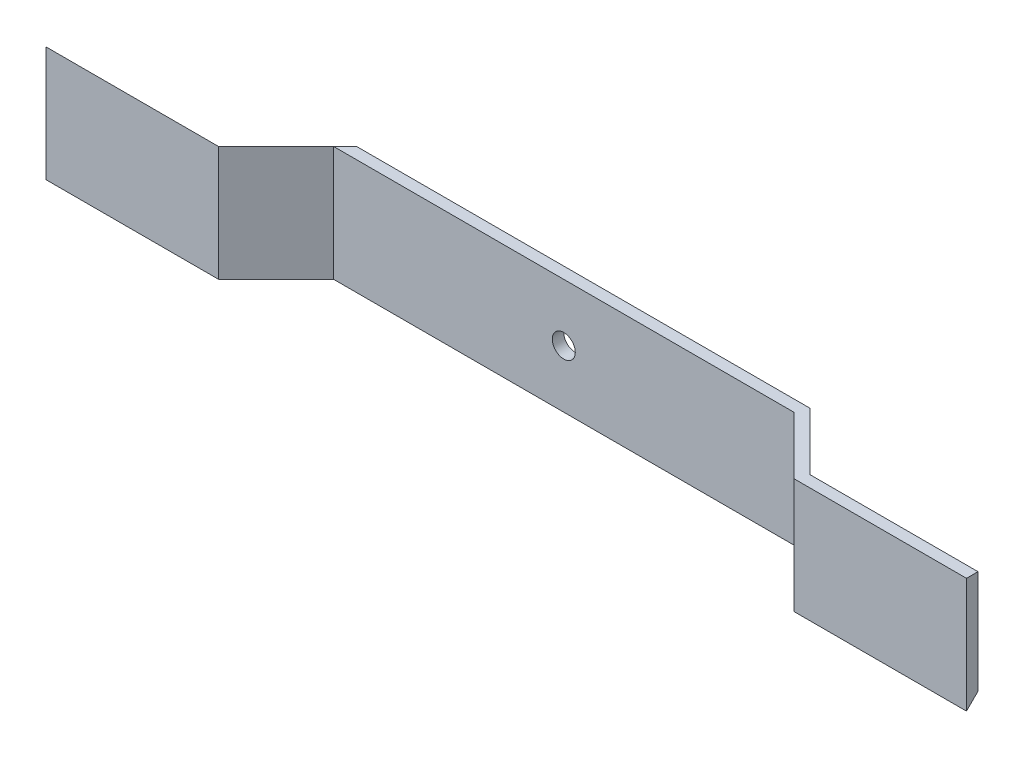
ISO-10303-21;
HEADER;
FILE_DESCRIPTION(('STEP AP214'),'2;1');
FILE_NAME('part.step','',(''),(''),'','','');
FILE_SCHEMA(('AUTOMOTIVE_DESIGN { 1 0 10303 214 1 1 1 1 }'));
ENDSEC;
DATA;
#1=APPLICATION_CONTEXT('core data for automotive mechanical design processes');
#2=APPLICATION_PROTOCOL_DEFINITION('international standard','automotive_design',2000,#1);
#3=PRODUCT_CONTEXT('',#1,'mechanical');
#4=PRODUCT('Part','Part','',(#3));
#5=PRODUCT_RELATED_PRODUCT_CATEGORY('part','',(#4));
#6=PRODUCT_DEFINITION_FORMATION('','',#4);
#7=PRODUCT_DEFINITION_CONTEXT('part definition',#1,'design');
#8=PRODUCT_DEFINITION('design','',#6,#7);
#9=PRODUCT_DEFINITION_SHAPE('','',#8);
#10=(LENGTH_UNIT() NAMED_UNIT(*) SI_UNIT(.MILLI.,.METRE.));
#11=(NAMED_UNIT(*) PLANE_ANGLE_UNIT() SI_UNIT($,.RADIAN.));
#12=(NAMED_UNIT(*) SI_UNIT($,.STERADIAN.) SOLID_ANGLE_UNIT());
#13=UNCERTAINTY_MEASURE_WITH_UNIT(LENGTH_MEASURE(1.E-05),#10,'distance_accuracy_value','');
#14=(GEOMETRIC_REPRESENTATION_CONTEXT(3) GLOBAL_UNCERTAINTY_ASSIGNED_CONTEXT((#13)) GLOBAL_UNIT_ASSIGNED_CONTEXT((#10,
#11,#12)) REPRESENTATION_CONTEXT('',''));
#15=CARTESIAN_POINT('',(0.,0.,0.));
#16=DIRECTION('',(0.,0.,1.));
#17=DIRECTION('',(1.,0.,0.));
#18=AXIS2_PLACEMENT_3D('',#15,#16,#17);
#19=CARTESIAN_POINT('',(-27.2373225025512,10.,0.));
#20=DIRECTION('',(-0.707106781186554,0.,-0.707106781186541));
#21=DIRECTION('',(-0.707106781186541,0.,0.707106781186554));
#22=AXIS2_PLACEMENT_3D('',#19,#20,#21);
#23=PLANE('',#22);
#24=DIRECTION('',(0.707106781186541,0.,-0.707106781186554));
#25=VECTOR('',#24,1.);
#26=CARTESIAN_POINT('',(-27.2373225025512,0.,0.));
#27=LINE('',#26,#25);
#28=CARTESIAN_POINT('',(-32.2373225025511,0.,5.));
#29=VERTEX_POINT('',#28);
#30=CARTESIAN_POINT('',(-27.2373225025512,0.,0.));
#31=VERTEX_POINT('',#30);
#32=EDGE_CURVE('E166',#29,#31,#27,.T.);
#33=ORIENTED_EDGE('',*,*,#32,.T.);
#34=DIRECTION('',(0.,-1.,0.));
#35=VECTOR('',#34,1.);
#36=CARTESIAN_POINT('',(-27.2373225025512,10.,0.));
#37=LINE('',#36,#35);
#38=CARTESIAN_POINT('',(-27.2373225025512,10.,0.));
#39=VERTEX_POINT('',#38);
#40=EDGE_CURVE('E153',#39,#31,#37,.T.);
#41=ORIENTED_EDGE('',*,*,#40,.F.);
#42=DIRECTION('',(0.707106781186541,0.,-0.707106781186554));
#43=VECTOR('',#42,1.);
#44=CARTESIAN_POINT('',(-27.2373225025512,10.,0.));
#45=LINE('',#44,#43);
#46=CARTESIAN_POINT('',(-32.2373225025511,10.,5.));
#47=VERTEX_POINT('',#46);
#48=EDGE_CURVE('E130',#47,#39,#45,.T.);
#49=ORIENTED_EDGE('',*,*,#48,.F.);
#50=DIRECTION('',(0.,-1.,0.));
#51=VECTOR('',#50,1.);
#52=CARTESIAN_POINT('',(-32.2373225025511,10.,5.));
#53=LINE('',#52,#51);
#54=EDGE_CURVE('E213',#47,#29,#53,.T.);
#55=ORIENTED_EDGE('',*,*,#54,.T.);
#56=EDGE_LOOP('',(#33,#41,#49,#55));
#57=FACE_BOUND('',#56,.T.);
#58=ADVANCED_FACE('F32',(#57),#23,.F.);
#59=CARTESIAN_POINT('',(-27.2373225025512,10.,0.));
#60=DIRECTION('',(0.,0.,-1.));
#61=DIRECTION('',(-1.,0.,0.));
#62=AXIS2_PLACEMENT_3D('',#59,#60,#61);
#63=PLANE('',#62);
#64=CARTESIAN_POINT('',(-7.23732250255115,5.,0.));
#65=DIRECTION('',(0.,0.,1.));
#66=DIRECTION('',(1.,0.,0.));
#67=AXIS2_PLACEMENT_3D('',#64,#65,#66);
#68=CIRCLE('',#67,1.);
#69=CARTESIAN_POINT('',(-6.23732250255115,5.,0.));
#70=VERTEX_POINT('',#69);
#71=EDGE_CURVE('E193',#70,#70,#68,.T.);
#72=ORIENTED_EDGE('',*,*,#71,.F.);
#73=EDGE_LOOP('',(#72));
#74=FACE_BOUND('',#73,.T.);
#75=DIRECTION('',(1.,0.,0.));
#76=VECTOR('',#75,1.);
#77=CARTESIAN_POINT('',(-27.2373225025512,0.,0.));
#78=LINE('',#77,#76);
#79=CARTESIAN_POINT('',(12.7626774974489,0.,0.));
#80=VERTEX_POINT('',#79);
#81=EDGE_CURVE('E215',#31,#80,#78,.T.);
#82=ORIENTED_EDGE('',*,*,#81,.T.);
#83=DIRECTION('',(0.,-1.,0.));
#84=VECTOR('',#83,1.);
#85=CARTESIAN_POINT('',(12.7626774974489,10.,0.));
#86=LINE('',#85,#84);
#87=CARTESIAN_POINT('',(12.7626774974489,10.,0.));
#88=VERTEX_POINT('',#87);
#89=EDGE_CURVE('E161',#88,#80,#86,.T.);
#90=ORIENTED_EDGE('',*,*,#89,.F.);
#91=DIRECTION('',(1.,0.,0.));
#92=VECTOR('',#91,1.);
#93=CARTESIAN_POINT('',(-27.2373225025512,10.,0.));
#94=LINE('',#93,#92);
#95=EDGE_CURVE('E142',#39,#88,#94,.T.);
#96=ORIENTED_EDGE('',*,*,#95,.F.);
#97=ORIENTED_EDGE('',*,*,#40,.T.);
#98=EDGE_LOOP('',(#82,#90,#96,#97));
#99=FACE_BOUND('',#98,.T.);
#100=ADVANCED_FACE('F158',(#74,#99),#63,.F.);
#101=CARTESIAN_POINT('',(12.7626774974489,10.,0.));
#102=DIRECTION('',(0.707106781186541,0.,-0.707106781186554));
#103=DIRECTION('',(-0.707106781186554,0.,-0.707106781186541));
#104=AXIS2_PLACEMENT_3D('',#101,#102,#103);
#105=PLANE('',#104);
#106=DIRECTION('',(0.707106781186554,0.,0.707106781186541));
#107=VECTOR('',#106,1.);
#108=CARTESIAN_POINT('',(12.7626774974489,0.,0.));
#109=LINE('',#108,#107);
#110=CARTESIAN_POINT('',(17.7626774974489,0.,5.));
#111=VERTEX_POINT('',#110);
#112=EDGE_CURVE('E217',#80,#111,#109,.T.);
#113=ORIENTED_EDGE('',*,*,#112,.T.);
#114=DIRECTION('',(0.,-1.,0.));
#115=VECTOR('',#114,1.);
#116=CARTESIAN_POINT('',(17.7626774974489,10.,5.));
#117=LINE('',#116,#115);
#118=CARTESIAN_POINT('',(17.7626774974489,10.,5.));
#119=VERTEX_POINT('',#118);
#120=EDGE_CURVE('E168',#119,#111,#117,.T.);
#121=ORIENTED_EDGE('',*,*,#120,.F.);
#122=DIRECTION('',(0.707106781186554,0.,0.707106781186541));
#123=VECTOR('',#122,1.);
#124=CARTESIAN_POINT('',(12.7626774974489,10.,0.));
#125=LINE('',#124,#123);
#126=EDGE_CURVE('E163',#88,#119,#125,.T.);
#127=ORIENTED_EDGE('',*,*,#126,.F.);
#128=ORIENTED_EDGE('',*,*,#89,.T.);
#129=EDGE_LOOP('',(#113,#121,#127,#128));
#130=FACE_BOUND('',#129,.T.);
#131=ADVANCED_FACE('F278',(#130),#105,.F.);
#132=CARTESIAN_POINT('',(17.7626774974489,10.,5.));
#133=DIRECTION('',(0.,0.,-1.));
#134=DIRECTION('',(-1.,0.,0.));
#135=AXIS2_PLACEMENT_3D('',#132,#133,#134);
#136=PLANE('',#135);
#137=DIRECTION('',(1.,0.,0.));
#138=VECTOR('',#137,1.);
#139=CARTESIAN_POINT('',(17.7626774974489,0.,5.));
#140=LINE('',#139,#138);
#141=CARTESIAN_POINT('',(32.7626774974489,0.,5.));
#142=VERTEX_POINT('',#141);
#143=EDGE_CURVE('E219',#111,#142,#140,.T.);
#144=ORIENTED_EDGE('',*,*,#143,.T.);
#145=DIRECTION('',(0.,-1.,0.));
#146=VECTOR('',#145,1.);
#147=CARTESIAN_POINT('',(32.7626774974489,10.,5.));
#148=LINE('',#147,#146);
#149=CARTESIAN_POINT('',(32.7626774974489,10.,5.));
#150=VERTEX_POINT('',#149);
#151=EDGE_CURVE('E250',#150,#142,#148,.T.);
#152=ORIENTED_EDGE('',*,*,#151,.F.);
#153=DIRECTION('',(1.,0.,0.));
#154=VECTOR('',#153,1.);
#155=CARTESIAN_POINT('',(17.7626774974489,10.,5.));
#156=LINE('',#155,#154);
#157=EDGE_CURVE('E202',#119,#150,#156,.T.);
#158=ORIENTED_EDGE('',*,*,#157,.F.);
#159=ORIENTED_EDGE('',*,*,#120,.T.);
#160=EDGE_LOOP('',(#144,#152,#158,#159));
#161=FACE_BOUND('',#160,.T.);
#162=ADVANCED_FACE('F256',(#161),#136,.F.);
#163=CARTESIAN_POINT('',(32.7626774974489,10.,4.));
#164=DIRECTION('',(-1.,0.,0.));
#165=DIRECTION('',(0.,0.,1.));
#166=AXIS2_PLACEMENT_3D('',#163,#164,#165);
#167=PLANE('',#166);
#168=ORIENTED_EDGE('',*,*,#151,.T.);
#169=DIRECTION('',(0.,-0.707106781186545,0.70710678118655));
#170=VECTOR('',#169,1.);
#171=CARTESIAN_POINT('',(32.7626774974489,0.999999999999994,4.));
#172=LINE('',#171,#170);
#173=CARTESIAN_POINT('',(32.7626774974489,0.999999999999997,4.));
#174=VERTEX_POINT('',#173);
#175=EDGE_CURVE('E11',#142,#174,#172,.F.);
#176=ORIENTED_EDGE('',*,*,#175,.T.);
#177=DIRECTION('',(0.,-1.,0.));
#178=VECTOR('',#177,1.);
#179=CARTESIAN_POINT('',(32.7626774974489,10.,4.));
#180=LINE('',#179,#178);
#181=CARTESIAN_POINT('',(32.7626774974489,10.,4.));
#182=VERTEX_POINT('',#181);
#183=EDGE_CURVE('E248',#182,#174,#180,.T.);
#184=ORIENTED_EDGE('',*,*,#183,.F.);
#185=DIRECTION('',(0.,0.,-1.));
#186=VECTOR('',#185,1.);
#187=CARTESIAN_POINT('',(32.7626774974489,10.,4.));
#188=LINE('',#187,#186);
#189=EDGE_CURVE('E204',#150,#182,#188,.T.);
#190=ORIENTED_EDGE('',*,*,#189,.F.);
#191=EDGE_LOOP('',(#168,#176,#184,#190));
#192=FACE_BOUND('',#191,.T.);
#193=ADVANCED_FACE('F270',(#192),#167,.F.);
#194=CARTESIAN_POINT('',(18.176891059822,10.,4.));
#195=DIRECTION('',(0.,0.,1.));
#196=DIRECTION('',(1.,0.,0.));
#197=AXIS2_PLACEMENT_3D('',#194,#195,#196);
#198=PLANE('',#197);
#199=ORIENTED_EDGE('',*,*,#183,.T.);
#200=DIRECTION('',(-1.,0.,0.));
#201=VECTOR('',#200,1.);
#202=CARTESIAN_POINT('',(18.176891059822,0.999999999999994,4.));
#203=LINE('',#202,#201);
#204=CARTESIAN_POINT('',(18.176891059822,0.999999999999994,4.));
#205=VERTEX_POINT('',#204);
#206=EDGE_CURVE('E41',#174,#205,#203,.T.);
#207=ORIENTED_EDGE('',*,*,#206,.T.);
#208=DIRECTION('',(0.,-1.,0.));
#209=VECTOR('',#208,1.);
#210=CARTESIAN_POINT('',(18.176891059822,10.,4.));
#211=LINE('',#210,#209);
#212=CARTESIAN_POINT('',(18.176891059822,10.,4.));
#213=VERTEX_POINT('',#212);
#214=EDGE_CURVE('E245',#213,#205,#211,.T.);
#215=ORIENTED_EDGE('',*,*,#214,.F.);
#216=DIRECTION('',(-1.,0.,0.));
#217=VECTOR('',#216,1.);
#218=CARTESIAN_POINT('',(18.176891059822,10.,4.));
#219=LINE('',#218,#217);
#220=EDGE_CURVE('E206',#182,#213,#219,.T.);
#221=ORIENTED_EDGE('',*,*,#220,.F.);
#222=EDGE_LOOP('',(#199,#207,#215,#221));
#223=FACE_BOUND('',#222,.T.);
#224=ADVANCED_FACE('F263',(#223),#198,.F.);
#225=CARTESIAN_POINT('',(13.1768910598219,10.,-1.));
#226=DIRECTION('',(-0.707106781186541,0.,0.707106781186554));
#227=DIRECTION('',(0.707106781186554,0.,0.707106781186541));
#228=AXIS2_PLACEMENT_3D('',#225,#226,#227);
#229=PLANE('',#228);
#230=ORIENTED_EDGE('',*,*,#214,.T.);
#231=DIRECTION('',(-0.707106781186554,0.,-0.707106781186541));
#232=VECTOR('',#231,1.);
#233=CARTESIAN_POINT('',(13.1768910598219,0.999999999999994,-1.));
#234=LINE('',#233,#232);
#235=CARTESIAN_POINT('',(13.1768910598219,0.999999999999993,-1.));
#236=VERTEX_POINT('',#235);
#237=EDGE_CURVE('E179',#205,#236,#234,.T.);
#238=ORIENTED_EDGE('',*,*,#237,.T.);
#239=DIRECTION('',(0.,-1.,0.));
#240=VECTOR('',#239,1.);
#241=CARTESIAN_POINT('',(13.1768910598219,10.,-1.));
#242=LINE('',#241,#240);
#243=CARTESIAN_POINT('',(13.1768910598219,10.,-1.));
#244=VERTEX_POINT('',#243);
#245=EDGE_CURVE('E243',#244,#236,#242,.T.);
#246=ORIENTED_EDGE('',*,*,#245,.F.);
#247=DIRECTION('',(-0.707106781186554,0.,-0.707106781186541));
#248=VECTOR('',#247,1.);
#249=CARTESIAN_POINT('',(13.1768910598219,10.,-1.));
#250=LINE('',#249,#248);
#251=EDGE_CURVE('E208',#213,#244,#250,.T.);
#252=ORIENTED_EDGE('',*,*,#251,.F.);
#253=EDGE_LOOP('',(#230,#238,#246,#252));
#254=FACE_BOUND('',#253,.T.);
#255=ADVANCED_FACE('F267',(#254),#229,.F.);
#256=CARTESIAN_POINT('',(-27.6515360649243,10.,-1.));
#257=DIRECTION('',(0.,0.,1.));
#258=DIRECTION('',(1.,0.,0.));
#259=AXIS2_PLACEMENT_3D('',#256,#257,#258);
#260=PLANE('',#259);
#261=CARTESIAN_POINT('',(-7.23732250255115,5.,-1.));
#262=DIRECTION('',(0.,0.,1.));
#263=DIRECTION('',(1.,0.,0.));
#264=AXIS2_PLACEMENT_3D('',#261,#262,#263);
#265=CIRCLE('',#264,1.);
#266=CARTESIAN_POINT('',(-6.23732250255115,5.,-1.));
#267=VERTEX_POINT('',#266);
#268=EDGE_CURVE('E36',#267,#267,#265,.T.);
#269=ORIENTED_EDGE('',*,*,#268,.T.);
#270=EDGE_LOOP('',(#269));
#271=FACE_BOUND('',#270,.T.);
#272=ORIENTED_EDGE('',*,*,#245,.T.);
#273=DIRECTION('',(0.81649658092773,0.57735026918962,0.));
#274=VECTOR('',#273,1.);
#275=CARTESIAN_POINT('',(13.1768910598219,0.999999999999994,-1.));
#276=LINE('',#275,#274);
#277=CARTESIAN_POINT('',(11.7626774974488,0.,-1.));
#278=VERTEX_POINT('',#277);
#279=EDGE_CURVE('E55',#236,#278,#276,.F.);
#280=ORIENTED_EDGE('',*,*,#279,.T.);
#281=DIRECTION('',(-1.,0.,0.));
#282=VECTOR('',#281,1.);
#283=CARTESIAN_POINT('',(-27.6515360649243,0.,-1.));
#284=LINE('',#283,#282);
#285=CARTESIAN_POINT('',(-27.6515360649243,0.,-1.));
#286=VERTEX_POINT('',#285);
#287=EDGE_CURVE('E221',#278,#286,#284,.T.);
#288=ORIENTED_EDGE('',*,*,#287,.T.);
#289=DIRECTION('',(0.,-1.,0.));
#290=VECTOR('',#289,1.);
#291=CARTESIAN_POINT('',(-27.6515360649243,10.,-1.));
#292=LINE('',#291,#290);
#293=CARTESIAN_POINT('',(-27.6515360649243,8.99999999999999,-1.));
#294=VERTEX_POINT('',#293);
#295=EDGE_CURVE('E240',#294,#286,#292,.T.);
#296=ORIENTED_EDGE('',*,*,#295,.F.);
#297=DIRECTION('',(0.816496580927722,0.577350269189632,0.));
#298=VECTOR('',#297,1.);
#299=CARTESIAN_POINT('',(-17.8248816683677,15.9484939601818,-0.999999999999999));
#300=LINE('',#299,#298);
#301=CARTESIAN_POINT('',(-26.2373225025512,10.,-1.));
#302=VERTEX_POINT('',#301);
#303=EDGE_CURVE('E173',#294,#302,#300,.T.);
#304=ORIENTED_EDGE('',*,*,#303,.T.);
#305=DIRECTION('',(-1.,0.,0.));
#306=VECTOR('',#305,1.);
#307=CARTESIAN_POINT('',(-27.6515360649243,10.,-1.));
#308=LINE('',#307,#306);
#309=EDGE_CURVE('E151',#244,#302,#308,.T.);
#310=ORIENTED_EDGE('',*,*,#309,.F.);
#311=EDGE_LOOP('',(#272,#280,#288,#296,#304,#310));
#312=FACE_BOUND('',#311,.T.);
#313=ADVANCED_FACE('F333',(#271,#312),#260,.F.);
#314=CARTESIAN_POINT('',(-27.6515360649243,10.,-1.));
#315=DIRECTION('',(0.707106781186554,0.,0.707106781186541));
#316=DIRECTION('',(0.707106781186541,0.,-0.707106781186554));
#317=AXIS2_PLACEMENT_3D('',#314,#315,#316);
#318=PLANE('',#317);
#319=DIRECTION('',(0.,-1.,0.));
#320=VECTOR('',#319,1.);
#321=CARTESIAN_POINT('',(-32.6515360649242,10.,4.));
#322=LINE('',#321,#320);
#323=CARTESIAN_POINT('',(-32.6515360649242,8.99999999999999,4.));
#324=VERTEX_POINT('',#323);
#325=CARTESIAN_POINT('',(-32.6515360649242,0.,4.));
#326=VERTEX_POINT('',#325);
#327=EDGE_CURVE('E238',#324,#326,#322,.T.);
#328=ORIENTED_EDGE('',*,*,#327,.F.);
#329=DIRECTION('',(0.707106781186541,0.,-0.707106781186554));
#330=VECTOR('',#329,1.);
#331=CARTESIAN_POINT('',(-27.6515360649243,8.99999999999999,-1.));
#332=LINE('',#331,#330);
#333=EDGE_CURVE('E152',#324,#294,#332,.T.);
#334=ORIENTED_EDGE('',*,*,#333,.T.);
#335=ORIENTED_EDGE('',*,*,#295,.T.);
#336=DIRECTION('',(-0.707106781186541,0.,0.707106781186554));
#337=VECTOR('',#336,1.);
#338=CARTESIAN_POINT('',(-27.6515360649243,0.,-1.));
#339=LINE('',#338,#337);
#340=EDGE_CURVE('E223',#286,#326,#339,.T.);
#341=ORIENTED_EDGE('',*,*,#340,.T.);
#342=EDGE_LOOP('',(#328,#334,#335,#341));
#343=FACE_BOUND('',#342,.T.);
#344=ADVANCED_FACE('F371',(#343),#318,.F.);
#345=CARTESIAN_POINT('',(-32.6515360649242,10.,4.));
#346=DIRECTION('',(0.,0.,1.));
#347=DIRECTION('',(1.,0.,0.));
#348=AXIS2_PLACEMENT_3D('',#345,#346,#347);
#349=PLANE('',#348);
#350=DIRECTION('',(0.,-1.,0.));
#351=VECTOR('',#350,1.);
#352=CARTESIAN_POINT('',(-47.2373225025511,10.,4.));
#353=LINE('',#352,#351);
#354=CARTESIAN_POINT('',(-47.2373225025511,8.99999999999999,4.));
#355=VERTEX_POINT('',#354);
#356=CARTESIAN_POINT('',(-47.2373225025511,0.,4.));
#357=VERTEX_POINT('',#356);
#358=EDGE_CURVE('E236',#355,#357,#353,.T.);
#359=ORIENTED_EDGE('',*,*,#358,.F.);
#360=DIRECTION('',(1.,0.,0.));
#361=VECTOR('',#360,1.);
#362=CARTESIAN_POINT('',(-32.6515360649242,8.99999999999999,4.));
#363=LINE('',#362,#361);
#364=EDGE_CURVE('E177',#355,#324,#363,.T.);
#365=ORIENTED_EDGE('',*,*,#364,.T.);
#366=ORIENTED_EDGE('',*,*,#327,.T.);
#367=DIRECTION('',(-1.,0.,0.));
#368=VECTOR('',#367,1.);
#369=CARTESIAN_POINT('',(-32.6515360649242,0.,4.));
#370=LINE('',#369,#368);
#371=EDGE_CURVE('E226',#326,#357,#370,.T.);
#372=ORIENTED_EDGE('',*,*,#371,.T.);
#373=EDGE_LOOP('',(#359,#365,#366,#372));
#374=FACE_BOUND('',#373,.T.);
#375=ADVANCED_FACE('F385',(#374),#349,.F.);
#376=CARTESIAN_POINT('',(-47.2373225025511,10.,4.));
#377=DIRECTION('',(1.,0.,0.));
#378=DIRECTION('',(0.,0.,-1.));
#379=AXIS2_PLACEMENT_3D('',#376,#377,#378);
#380=PLANE('',#379);
#381=DIRECTION('',(0.,-1.,0.));
#382=VECTOR('',#381,1.);
#383=CARTESIAN_POINT('',(-47.2373225025511,10.,5.));
#384=LINE('',#383,#382);
#385=CARTESIAN_POINT('',(-47.2373225025511,10.,5.));
#386=VERTEX_POINT('',#385);
#387=CARTESIAN_POINT('',(-47.2373225025511,0.,5.));
#388=VERTEX_POINT('',#387);
#389=EDGE_CURVE('E233',#386,#388,#384,.T.);
#390=ORIENTED_EDGE('',*,*,#389,.F.);
#391=DIRECTION('',(0.,-0.70710678118655,-0.707106781186545));
#392=VECTOR('',#391,1.);
#393=CARTESIAN_POINT('',(-47.2373225025511,10.,5.));
#394=LINE('',#393,#392);
#395=EDGE_CURVE('E175',#386,#355,#394,.T.);
#396=ORIENTED_EDGE('',*,*,#395,.T.);
#397=ORIENTED_EDGE('',*,*,#358,.T.);
#398=DIRECTION('',(0.,0.,1.));
#399=VECTOR('',#398,1.);
#400=CARTESIAN_POINT('',(-47.2373225025511,0.,4.));
#401=LINE('',#400,#399);
#402=EDGE_CURVE('E229',#357,#388,#401,.T.);
#403=ORIENTED_EDGE('',*,*,#402,.T.);
#404=EDGE_LOOP('',(#390,#396,#397,#403));
#405=FACE_BOUND('',#404,.T.);
#406=ADVANCED_FACE('F392',(#405),#380,.F.);
#407=CARTESIAN_POINT('',(-32.2373225025511,10.,5.));
#408=DIRECTION('',(0.,0.,-1.));
#409=DIRECTION('',(-1.,0.,0.));
#410=AXIS2_PLACEMENT_3D('',#407,#408,#409);
#411=PLANE('',#410);
#412=DIRECTION('',(1.,0.,0.));
#413=VECTOR('',#412,1.);
#414=CARTESIAN_POINT('',(-32.2373225025511,0.,5.));
#415=LINE('',#414,#413);
#416=EDGE_CURVE('E143',#388,#29,#415,.T.);
#417=ORIENTED_EDGE('',*,*,#416,.T.);
#418=ORIENTED_EDGE('',*,*,#54,.F.);
#419=DIRECTION('',(1.,0.,0.));
#420=VECTOR('',#419,1.);
#421=CARTESIAN_POINT('',(-32.2373225025511,10.,5.));
#422=LINE('',#421,#420);
#423=EDGE_CURVE('E211',#386,#47,#422,.T.);
#424=ORIENTED_EDGE('',*,*,#423,.F.);
#425=ORIENTED_EDGE('',*,*,#389,.T.);
#426=EDGE_LOOP('',(#417,#418,#424,#425));
#427=FACE_BOUND('',#426,.T.);
#428=ADVANCED_FACE('F400',(#427),#411,.F.);
#429=CARTESIAN_POINT('',(0.,10.,0.));
#430=DIRECTION('',(0.,1.,0.));
#431=DIRECTION('',(0.,0.,1.));
#432=AXIS2_PLACEMENT_3D('',#429,#430,#431);
#433=PLANE('',#432);
#434=ORIENTED_EDGE('',*,*,#309,.T.);
#435=DIRECTION('',(-0.707106781186541,0.,0.707106781186554));
#436=VECTOR('',#435,1.);
#437=CARTESIAN_POINT('',(-31.9444292837376,10.,4.70710678118655));
#438=LINE('',#437,#436);
#439=EDGE_CURVE('E134',#302,#39,#438,.T.);
#440=ORIENTED_EDGE('',*,*,#439,.T.);
#441=ORIENTED_EDGE('',*,*,#95,.T.);
#442=ORIENTED_EDGE('',*,*,#126,.T.);
#443=ORIENTED_EDGE('',*,*,#157,.T.);
#444=ORIENTED_EDGE('',*,*,#189,.T.);
#445=ORIENTED_EDGE('',*,*,#220,.T.);
#446=ORIENTED_EDGE('',*,*,#251,.T.);
#447=EDGE_LOOP('',(#434,#440,#441,#442,#443,#444,#445,#446));
#448=FACE_BOUND('',#447,.T.);
#449=ADVANCED_FACE('F148',(#448),#433,.T.);
#450=CARTESIAN_POINT('',(0.,0.,0.));
#451=DIRECTION('',(0.,1.,0.));
#452=DIRECTION('',(0.,0.,1.));
#453=AXIS2_PLACEMENT_3D('',#450,#451,#452);
#454=PLANE('',#453);
#455=ORIENTED_EDGE('',*,*,#287,.F.);
#456=DIRECTION('',(0.707106781186554,0.,0.707106781186541));
#457=VECTOR('',#456,1.);
#458=CARTESIAN_POINT('',(6.38133874872431,0.,-6.38133874872442));
#459=LINE('',#458,#457);
#460=EDGE_CURVE('E185',#278,#80,#459,.T.);
#461=ORIENTED_EDGE('',*,*,#460,.T.);
#462=ORIENTED_EDGE('',*,*,#81,.F.);
#463=ORIENTED_EDGE('',*,*,#32,.F.);
#464=ORIENTED_EDGE('',*,*,#416,.F.);
#465=ORIENTED_EDGE('',*,*,#402,.F.);
#466=ORIENTED_EDGE('',*,*,#371,.F.);
#467=ORIENTED_EDGE('',*,*,#340,.F.);
#468=EDGE_LOOP('',(#455,#461,#462,#463,#464,#465,#466,#467));
#469=FACE_BOUND('',#468,.T.);
#470=ADVANCED_FACE('F293',(#469),#454,.F.);
#471=CARTESIAN_POINT('',(0.,10.,5.));
#472=DIRECTION('',(0.,0.707106781186545,-0.70710678118655));
#473=DIRECTION('',(1.,0.,0.));
#474=AXIS2_PLACEMENT_3D('',#471,#472,#473);
#475=PLANE('',#474);
#476=ORIENTED_EDGE('',*,*,#395,.F.);
#477=ORIENTED_EDGE('',*,*,#423,.T.);
#478=DIRECTION('',(-0.281084637714823,-0.678598344545849,-0.678598344545844));
#479=VECTOR('',#478,1.);
#480=CARTESIAN_POINT('',(-34.3176785480385,4.97757622041945,-0.0224237795805101));
#481=LINE('',#480,#479);
#482=EDGE_CURVE('E137',#324,#47,#481,.F.);
#483=ORIENTED_EDGE('',*,*,#482,.F.);
#484=ORIENTED_EDGE('',*,*,#364,.F.);
#485=EDGE_LOOP('',(#476,#477,#483,#484));
#486=FACE_BOUND('',#485,.T.);
#487=ADVANCED_FACE('F291',(#486),#475,.T.);
#488=CARTESIAN_POINT('',(-13.6186612512758,10.,-13.6186612512756));
#489=DIRECTION('',(-0.500000000000006,0.707106781186545,-0.499999999999997));
#490=DIRECTION('',(0.707106781186541,0.,-0.707106781186554));
#491=AXIS2_PLACEMENT_3D('',#488,#489,#490);
#492=PLANE('',#491);
#493=ORIENTED_EDGE('',*,*,#303,.F.);
#494=ORIENTED_EDGE('',*,*,#333,.F.);
#495=ORIENTED_EDGE('',*,*,#482,.T.);
#496=ORIENTED_EDGE('',*,*,#48,.T.);
#497=ORIENTED_EDGE('',*,*,#439,.F.);
#498=EDGE_LOOP('',(#493,#494,#495,#496,#497));
#499=FACE_BOUND('',#498,.T.);
#500=ADVANCED_FACE('F133',(#499),#492,.T.);
#501=CARTESIAN_POINT('',(18.176891059822,0.999999999999994,4.));
#502=DIRECTION('',(0.,0.70710678118655,0.707106781186545));
#503=DIRECTION('',(-1.,0.,0.));
#504=AXIS2_PLACEMENT_3D('',#501,#502,#503);
#505=PLANE('',#504);
#506=ORIENTED_EDGE('',*,*,#175,.F.);
#507=ORIENTED_EDGE('',*,*,#143,.F.);
#508=DIRECTION('',(0.281084637714818,0.678598344545845,-0.67859834454585));
#509=VECTOR('',#508,1.);
#510=CARTESIAN_POINT('',(18.7355660411784,2.34876071694908,2.6512392830509));
#511=LINE('',#510,#509);
#512=EDGE_CURVE('E181',#205,#111,#511,.F.);
#513=ORIENTED_EDGE('',*,*,#512,.F.);
#514=ORIENTED_EDGE('',*,*,#206,.F.);
#515=EDGE_LOOP('',(#506,#507,#513,#514));
#516=FACE_BOUND('',#515,.T.);
#517=ADVANCED_FACE('F34',(#516),#505,.F.);
#518=CARTESIAN_POINT('',(13.1768910598219,0.999999999999994,-1.));
#519=DIRECTION('',(-0.499999999999994,0.70710678118655,0.500000000000003));
#520=DIRECTION('',(-0.707106781186554,0.,-0.707106781186541));
#521=AXIS2_PLACEMENT_3D('',#518,#519,#520);
#522=PLANE('',#521);
#523=ORIENTED_EDGE('',*,*,#112,.F.);
#524=ORIENTED_EDGE('',*,*,#460,.F.);
#525=ORIENTED_EDGE('',*,*,#279,.F.);
#526=ORIENTED_EDGE('',*,*,#237,.F.);
#527=ORIENTED_EDGE('',*,*,#512,.T.);
#528=EDGE_LOOP('',(#523,#524,#525,#526,#527));
#529=FACE_BOUND('',#528,.T.);
#530=ADVANCED_FACE('F295',(#529),#522,.F.);
#531=CARTESIAN_POINT('',(-7.23732250255115,5.,-20.));
#532=DIRECTION('',(0.,0.,1.));
#533=DIRECTION('',(1.,0.,0.));
#534=AXIS2_PLACEMENT_3D('',#531,#532,#533);
#535=CYLINDRICAL_SURFACE('',#534,1.);
#536=ORIENTED_EDGE('',*,*,#71,.T.);
#537=EDGE_LOOP('',(#536));
#538=FACE_BOUND('',#537,.T.);
#539=ORIENTED_EDGE('',*,*,#268,.F.);
#540=EDGE_LOOP('',(#539));
#541=FACE_BOUND('',#540,.T.);
#542=ADVANCED_FACE('F297',(#538,#541),#535,.F.);
#543=CLOSED_SHELL('',(#58,#100,#131,#162,#193,#224,#255,#313,#344,#375,#406,#428,#449,#470,#487,
#500,#517,#530,#542));
#544=MANIFOLD_SOLID_BREP('B2',#543);
#545=ADVANCED_BREP_SHAPE_REPRESENTATION('',(#18,#544),#14);
#546=SHAPE_DEFINITION_REPRESENTATION(#9,#545);
ENDSEC;
END-ISO-10303-21;
